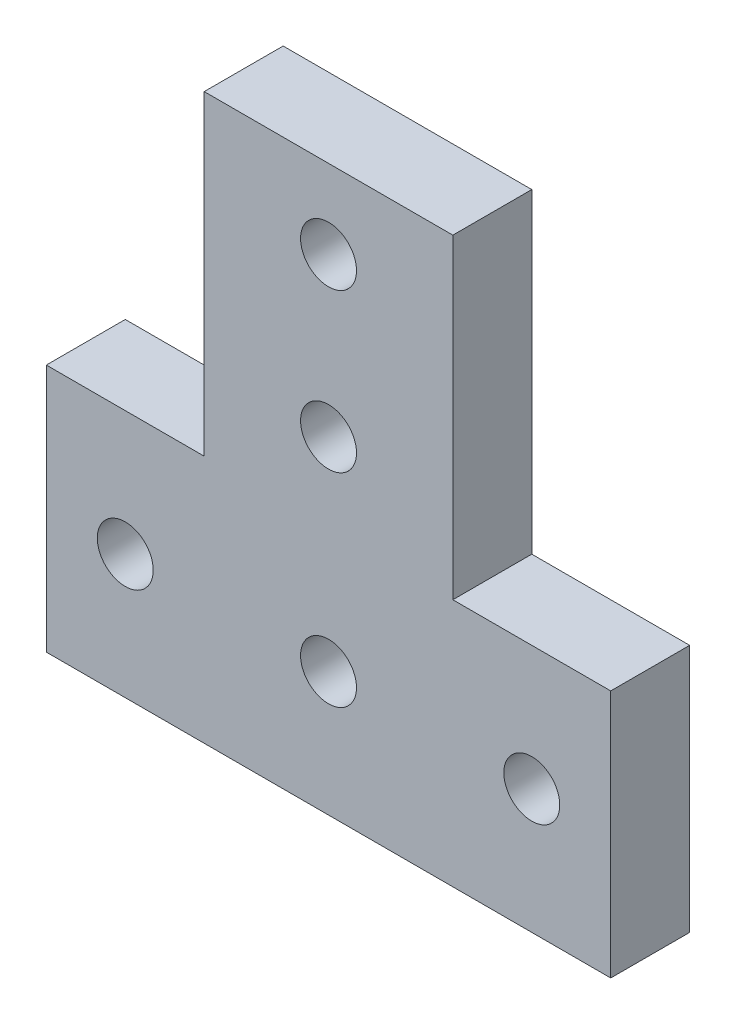
ISO-10303-21;
HEADER;
FILE_DESCRIPTION(('STEP AP214'),'2;1');
FILE_NAME('part.step','',(''),(''),'','','');
FILE_SCHEMA(('AUTOMOTIVE_DESIGN { 1 0 10303 214 1 1 1 1 }'));
ENDSEC;
DATA;
#1=APPLICATION_CONTEXT('core data for automotive mechanical design processes');
#2=APPLICATION_PROTOCOL_DEFINITION('international standard','automotive_design',2000,#1);
#3=PRODUCT_CONTEXT('',#1,'mechanical');
#4=PRODUCT('Part','Part','',(#3));
#5=PRODUCT_RELATED_PRODUCT_CATEGORY('part','',(#4));
#6=PRODUCT_DEFINITION_FORMATION('','',#4);
#7=PRODUCT_DEFINITION_CONTEXT('part definition',#1,'design');
#8=PRODUCT_DEFINITION('design','',#6,#7);
#9=PRODUCT_DEFINITION_SHAPE('','',#8);
#10=(LENGTH_UNIT() NAMED_UNIT(*) SI_UNIT(.MILLI.,.METRE.));
#11=(NAMED_UNIT(*) PLANE_ANGLE_UNIT() SI_UNIT($,.RADIAN.));
#12=(NAMED_UNIT(*) SI_UNIT($,.STERADIAN.) SOLID_ANGLE_UNIT());
#13=UNCERTAINTY_MEASURE_WITH_UNIT(LENGTH_MEASURE(1.E-05),#10,'distance_accuracy_value','');
#14=(GEOMETRIC_REPRESENTATION_CONTEXT(3) GLOBAL_UNCERTAINTY_ASSIGNED_CONTEXT((#13)) GLOBAL_UNIT_ASSIGNED_CONTEXT((#10,
#11,#12)) REPRESENTATION_CONTEXT('',''));
#15=CARTESIAN_POINT('',(0.,0.,0.));
#16=DIRECTION('',(0.,0.,1.));
#17=DIRECTION('',(1.,0.,0.));
#18=AXIS2_PLACEMENT_3D('',#15,#16,#17);
#19=CARTESIAN_POINT('',(10.,0.,6.35));
#20=DIRECTION('',(-1.,0.,0.));
#21=DIRECTION('',(0.,0.,1.));
#22=AXIS2_PLACEMENT_3D('',#19,#20,#21);
#23=PLANE('',#22);
#24=DIRECTION('',(0.,1.,0.));
#25=VECTOR('',#24,1.);
#26=CARTESIAN_POINT('',(10.,0.,0.));
#27=LINE('',#26,#25);
#28=CARTESIAN_POINT('',(10.,-12.7,0.));
#29=VERTEX_POINT('',#28);
#30=CARTESIAN_POINT('',(10.,12.7,0.));
#31=VERTEX_POINT('',#30);
#32=EDGE_CURVE('E145',#29,#31,#27,.T.);
#33=ORIENTED_EDGE('',*,*,#32,.T.);
#34=DIRECTION('',(0.,0.,-1.));
#35=VECTOR('',#34,1.);
#36=CARTESIAN_POINT('',(10.,12.7,6.35));
#37=LINE('',#36,#35);
#38=CARTESIAN_POINT('',(10.,12.7,6.35));
#39=VERTEX_POINT('',#38);
#40=EDGE_CURVE('E11',#39,#31,#37,.T.);
#41=ORIENTED_EDGE('',*,*,#40,.F.);
#42=DIRECTION('',(0.,1.,0.));
#43=VECTOR('',#42,1.);
#44=CARTESIAN_POINT('',(10.,0.,6.35));
#45=LINE('',#44,#43);
#46=CARTESIAN_POINT('',(10.,-12.7,6.35));
#47=VERTEX_POINT('',#46);
#48=EDGE_CURVE('E88',#47,#39,#45,.T.);
#49=ORIENTED_EDGE('',*,*,#48,.F.);
#50=DIRECTION('',(0.,0.,-1.));
#51=VECTOR('',#50,1.);
#52=CARTESIAN_POINT('',(10.,-12.7,6.35));
#53=LINE('',#52,#51);
#54=EDGE_CURVE('E51',#47,#29,#53,.T.);
#55=ORIENTED_EDGE('',*,*,#54,.T.);
#56=EDGE_LOOP('',(#33,#41,#49,#55));
#57=FACE_BOUND('',#56,.T.);
#58=ADVANCED_FACE('F35',(#57),#23,.F.);
#59=CARTESIAN_POINT('',(0.,12.7,6.35));
#60=DIRECTION('',(0.,1.,0.));
#61=DIRECTION('',(0.,0.,1.));
#62=AXIS2_PLACEMENT_3D('',#59,#60,#61);
#63=PLANE('',#62);
#64=DIRECTION('',(1.,0.,0.));
#65=VECTOR('',#64,1.);
#66=CARTESIAN_POINT('',(0.,12.7,0.));
#67=LINE('',#66,#65);
#68=CARTESIAN_POINT('',(-10.,12.7,0.));
#69=VERTEX_POINT('',#68);
#70=EDGE_CURVE('E147',#69,#31,#67,.T.);
#71=ORIENTED_EDGE('',*,*,#70,.F.);
#72=DIRECTION('',(0.,0.,-1.));
#73=VECTOR('',#72,1.);
#74=CARTESIAN_POINT('',(-10.,12.7,6.35));
#75=LINE('',#74,#73);
#76=CARTESIAN_POINT('',(-10.,12.7,6.35));
#77=VERTEX_POINT('',#76);
#78=EDGE_CURVE('E43',#77,#69,#75,.T.);
#79=ORIENTED_EDGE('',*,*,#78,.F.);
#80=DIRECTION('',(1.,0.,0.));
#81=VECTOR('',#80,1.);
#82=CARTESIAN_POINT('',(0.,12.7,6.35));
#83=LINE('',#82,#81);
#84=EDGE_CURVE('E211',#77,#39,#83,.T.);
#85=ORIENTED_EDGE('',*,*,#84,.T.);
#86=ORIENTED_EDGE('',*,*,#40,.T.);
#87=EDGE_LOOP('',(#71,#79,#85,#86));
#88=FACE_BOUND('',#87,.T.);
#89=ADVANCED_FACE('F195',(#88),#63,.T.);
#90=CARTESIAN_POINT('',(-10.,0.,6.35));
#91=DIRECTION('',(-1.,0.,0.));
#92=DIRECTION('',(0.,0.,1.));
#93=AXIS2_PLACEMENT_3D('',#90,#91,#92);
#94=PLANE('',#93);
#95=DIRECTION('',(0.,1.,0.));
#96=VECTOR('',#95,1.);
#97=CARTESIAN_POINT('',(-10.,0.,0.));
#98=LINE('',#97,#96);
#99=CARTESIAN_POINT('',(-10.,-12.7,0.));
#100=VERTEX_POINT('',#99);
#101=EDGE_CURVE('E150',#100,#69,#98,.T.);
#102=ORIENTED_EDGE('',*,*,#101,.F.);
#103=DIRECTION('',(0.,0.,-1.));
#104=VECTOR('',#103,1.);
#105=CARTESIAN_POINT('',(-10.,-12.7,6.35));
#106=LINE('',#105,#104);
#107=CARTESIAN_POINT('',(-10.,-12.7,6.35));
#108=VERTEX_POINT('',#107);
#109=EDGE_CURVE('E185',#108,#100,#106,.T.);
#110=ORIENTED_EDGE('',*,*,#109,.F.);
#111=DIRECTION('',(0.,1.,0.));
#112=VECTOR('',#111,1.);
#113=CARTESIAN_POINT('',(-10.,0.,6.35));
#114=LINE('',#113,#112);
#115=EDGE_CURVE('E192',#108,#77,#114,.T.);
#116=ORIENTED_EDGE('',*,*,#115,.T.);
#117=ORIENTED_EDGE('',*,*,#78,.T.);
#118=EDGE_LOOP('',(#102,#110,#116,#117));
#119=FACE_BOUND('',#118,.T.);
#120=ADVANCED_FACE('F190',(#119),#94,.T.);
#121=CARTESIAN_POINT('',(0.,-12.7,6.35));
#122=DIRECTION('',(0.,-1.,0.));
#123=DIRECTION('',(0.,0.,-1.));
#124=AXIS2_PLACEMENT_3D('',#121,#122,#123);
#125=PLANE('',#124);
#126=DIRECTION('',(-1.,0.,0.));
#127=VECTOR('',#126,1.);
#128=CARTESIAN_POINT('',(0.,-12.7,0.));
#129=LINE('',#128,#127);
#130=CARTESIAN_POINT('',(-22.7,-12.7,0.));
#131=VERTEX_POINT('',#130);
#132=EDGE_CURVE('E153',#100,#131,#129,.T.);
#133=ORIENTED_EDGE('',*,*,#132,.T.);
#134=DIRECTION('',(0.,0.,-1.));
#135=VECTOR('',#134,1.);
#136=CARTESIAN_POINT('',(-22.7,-12.7,6.35));
#137=LINE('',#136,#135);
#138=CARTESIAN_POINT('',(-22.7,-12.7,6.35));
#139=VERTEX_POINT('',#138);
#140=EDGE_CURVE('E182',#139,#131,#137,.T.);
#141=ORIENTED_EDGE('',*,*,#140,.F.);
#142=DIRECTION('',(-1.,0.,0.));
#143=VECTOR('',#142,1.);
#144=CARTESIAN_POINT('',(0.,-12.7,6.35));
#145=LINE('',#144,#143);
#146=EDGE_CURVE('E207',#108,#139,#145,.T.);
#147=ORIENTED_EDGE('',*,*,#146,.F.);
#148=ORIENTED_EDGE('',*,*,#109,.T.);
#149=EDGE_LOOP('',(#133,#141,#147,#148));
#150=FACE_BOUND('',#149,.T.);
#151=ADVANCED_FACE('F203',(#150),#125,.F.);
#152=CARTESIAN_POINT('',(-22.7,0.,6.35));
#153=DIRECTION('',(1.,0.,0.));
#154=DIRECTION('',(0.,0.,-1.));
#155=AXIS2_PLACEMENT_3D('',#152,#153,#154);
#156=PLANE('',#155);
#157=DIRECTION('',(0.,-1.,0.));
#158=VECTOR('',#157,1.);
#159=CARTESIAN_POINT('',(-22.7,0.,0.));
#160=LINE('',#159,#158);
#161=CARTESIAN_POINT('',(-22.7,-32.7,0.));
#162=VERTEX_POINT('',#161);
#163=EDGE_CURVE('E155',#131,#162,#160,.T.);
#164=ORIENTED_EDGE('',*,*,#163,.T.);
#165=DIRECTION('',(0.,0.,-1.));
#166=VECTOR('',#165,1.);
#167=CARTESIAN_POINT('',(-22.7,-32.7,6.35));
#168=LINE('',#167,#166);
#169=CARTESIAN_POINT('',(-22.7,-32.7,6.35));
#170=VERTEX_POINT('',#169);
#171=EDGE_CURVE('E114',#170,#162,#168,.T.);
#172=ORIENTED_EDGE('',*,*,#171,.F.);
#173=DIRECTION('',(0.,-1.,0.));
#174=VECTOR('',#173,1.);
#175=CARTESIAN_POINT('',(-22.7,0.,6.35));
#176=LINE('',#175,#174);
#177=EDGE_CURVE('E121',#139,#170,#176,.T.);
#178=ORIENTED_EDGE('',*,*,#177,.F.);
#179=ORIENTED_EDGE('',*,*,#140,.T.);
#180=EDGE_LOOP('',(#164,#172,#178,#179));
#181=FACE_BOUND('',#180,.T.);
#182=ADVANCED_FACE('F206',(#181),#156,.F.);
#183=CARTESIAN_POINT('',(0.,-32.7,6.35));
#184=DIRECTION('',(0.,-1.,0.));
#185=DIRECTION('',(0.,0.,-1.));
#186=AXIS2_PLACEMENT_3D('',#183,#184,#185);
#187=PLANE('',#186);
#188=DIRECTION('',(-1.,0.,0.));
#189=VECTOR('',#188,1.);
#190=CARTESIAN_POINT('',(0.,-32.7,0.));
#191=LINE('',#190,#189);
#192=CARTESIAN_POINT('',(22.7,-32.7,0.));
#193=VERTEX_POINT('',#192);
#194=EDGE_CURVE('E110',#193,#162,#191,.T.);
#195=ORIENTED_EDGE('',*,*,#194,.F.);
#196=DIRECTION('',(0.,0.,-1.));
#197=VECTOR('',#196,1.);
#198=CARTESIAN_POINT('',(22.7,-32.7,6.35));
#199=LINE('',#198,#197);
#200=CARTESIAN_POINT('',(22.7,-32.7,6.35));
#201=VERTEX_POINT('',#200);
#202=EDGE_CURVE('E105',#201,#193,#199,.T.);
#203=ORIENTED_EDGE('',*,*,#202,.F.);
#204=DIRECTION('',(-1.,0.,0.));
#205=VECTOR('',#204,1.);
#206=CARTESIAN_POINT('',(0.,-32.7,6.35));
#207=LINE('',#206,#205);
#208=EDGE_CURVE('E108',#201,#170,#207,.T.);
#209=ORIENTED_EDGE('',*,*,#208,.T.);
#210=ORIENTED_EDGE('',*,*,#171,.T.);
#211=EDGE_LOOP('',(#195,#203,#209,#210));
#212=FACE_BOUND('',#211,.T.);
#213=ADVANCED_FACE('F107',(#212),#187,.T.);
#214=CARTESIAN_POINT('',(22.7,0.,6.35));
#215=DIRECTION('',(1.,0.,0.));
#216=DIRECTION('',(0.,0.,-1.));
#217=AXIS2_PLACEMENT_3D('',#214,#215,#216);
#218=PLANE('',#217);
#219=DIRECTION('',(0.,-1.,0.));
#220=VECTOR('',#219,1.);
#221=CARTESIAN_POINT('',(22.7,0.,0.));
#222=LINE('',#221,#220);
#223=CARTESIAN_POINT('',(22.7,-12.7,0.));
#224=VERTEX_POINT('',#223);
#225=EDGE_CURVE('E159',#224,#193,#222,.T.);
#226=ORIENTED_EDGE('',*,*,#225,.F.);
#227=DIRECTION('',(0.,0.,-1.));
#228=VECTOR('',#227,1.);
#229=CARTESIAN_POINT('',(22.7,-12.7,6.35));
#230=LINE('',#229,#228);
#231=CARTESIAN_POINT('',(22.7,-12.7,6.35));
#232=VERTEX_POINT('',#231);
#233=EDGE_CURVE('E76',#232,#224,#230,.T.);
#234=ORIENTED_EDGE('',*,*,#233,.F.);
#235=DIRECTION('',(0.,-1.,0.));
#236=VECTOR('',#235,1.);
#237=CARTESIAN_POINT('',(22.7,0.,6.35));
#238=LINE('',#237,#236);
#239=EDGE_CURVE('E119',#232,#201,#238,.T.);
#240=ORIENTED_EDGE('',*,*,#239,.T.);
#241=ORIENTED_EDGE('',*,*,#202,.T.);
#242=EDGE_LOOP('',(#226,#234,#240,#241));
#243=FACE_BOUND('',#242,.T.);
#244=ADVANCED_FACE('F124',(#243),#218,.T.);
#245=CARTESIAN_POINT('',(0.,-22.7,6.35));
#246=DIRECTION('',(0.,0.,-1.));
#247=DIRECTION('',(-1.,0.,0.));
#248=AXIS2_PLACEMENT_3D('',#245,#246,#247);
#249=CYLINDRICAL_SURFACE('',#248,2.25);
#250=CARTESIAN_POINT('',(0.,-22.7,6.35));
#251=DIRECTION('',(0.,0.,1.));
#252=DIRECTION('',(1.,0.,0.));
#253=AXIS2_PLACEMENT_3D('',#250,#251,#252);
#254=CIRCLE('',#253,2.25);
#255=CARTESIAN_POINT('',(2.25,-22.7,6.35));
#256=VERTEX_POINT('',#255);
#257=EDGE_CURVE('E139',#256,#256,#254,.T.);
#258=ORIENTED_EDGE('',*,*,#257,.T.);
#259=EDGE_LOOP('',(#258));
#260=FACE_BOUND('',#259,.T.);
#261=CARTESIAN_POINT('',(0.,-22.7,0.));
#262=DIRECTION('',(0.,0.,1.));
#263=DIRECTION('',(1.,0.,0.));
#264=AXIS2_PLACEMENT_3D('',#261,#262,#263);
#265=CIRCLE('',#264,2.25);
#266=CARTESIAN_POINT('',(2.25,-22.7,0.));
#267=VERTEX_POINT('',#266);
#268=EDGE_CURVE('E173',#267,#267,#265,.T.);
#269=ORIENTED_EDGE('',*,*,#268,.F.);
#270=EDGE_LOOP('',(#269));
#271=FACE_BOUND('',#270,.T.);
#272=ADVANCED_FACE('F243',(#260,#271),#249,.F.);
#273=CARTESIAN_POINT('',(0.,-6.35,6.35));
#274=DIRECTION('',(0.,0.,-1.));
#275=DIRECTION('',(-1.,0.,0.));
#276=AXIS2_PLACEMENT_3D('',#273,#274,#275);
#277=CYLINDRICAL_SURFACE('',#276,2.25);
#278=CARTESIAN_POINT('',(0.,-6.35,6.35));
#279=DIRECTION('',(0.,0.,1.));
#280=DIRECTION('',(1.,0.,0.));
#281=AXIS2_PLACEMENT_3D('',#278,#279,#280);
#282=CIRCLE('',#281,2.25);
#283=CARTESIAN_POINT('',(2.25,-6.35,6.35));
#284=VERTEX_POINT('',#283);
#285=EDGE_CURVE('E136',#284,#284,#282,.T.);
#286=ORIENTED_EDGE('',*,*,#285,.T.);
#287=EDGE_LOOP('',(#286));
#288=FACE_BOUND('',#287,.T.);
#289=CARTESIAN_POINT('',(0.,-6.35,0.));
#290=DIRECTION('',(0.,0.,1.));
#291=DIRECTION('',(1.,0.,0.));
#292=AXIS2_PLACEMENT_3D('',#289,#290,#291);
#293=CIRCLE('',#292,2.25);
#294=CARTESIAN_POINT('',(2.25,-6.35,0.));
#295=VERTEX_POINT('',#294);
#296=EDGE_CURVE('E170',#295,#295,#293,.T.);
#297=ORIENTED_EDGE('',*,*,#296,.F.);
#298=EDGE_LOOP('',(#297));
#299=FACE_BOUND('',#298,.T.);
#300=ADVANCED_FACE('F247',(#288,#299),#277,.F.);
#301=CARTESIAN_POINT('',(16.35,-22.7,6.35));
#302=DIRECTION('',(0.,0.,-1.));
#303=DIRECTION('',(-1.,0.,0.));
#304=AXIS2_PLACEMENT_3D('',#301,#302,#303);
#305=CYLINDRICAL_SURFACE('',#304,2.25);
#306=CARTESIAN_POINT('',(16.35,-22.7,6.35));
#307=DIRECTION('',(0.,0.,1.));
#308=DIRECTION('',(1.,0.,0.));
#309=AXIS2_PLACEMENT_3D('',#306,#307,#308);
#310=CIRCLE('',#309,2.25);
#311=CARTESIAN_POINT('',(18.6,-22.7,6.35));
#312=VERTEX_POINT('',#311);
#313=EDGE_CURVE('E133',#312,#312,#310,.T.);
#314=ORIENTED_EDGE('',*,*,#313,.T.);
#315=EDGE_LOOP('',(#314));
#316=FACE_BOUND('',#315,.T.);
#317=CARTESIAN_POINT('',(16.35,-22.7,0.));
#318=DIRECTION('',(0.,0.,1.));
#319=DIRECTION('',(1.,0.,0.));
#320=AXIS2_PLACEMENT_3D('',#317,#318,#319);
#321=CIRCLE('',#320,2.25);
#322=CARTESIAN_POINT('',(18.6,-22.7,0.));
#323=VERTEX_POINT('',#322);
#324=EDGE_CURVE('E167',#323,#323,#321,.T.);
#325=ORIENTED_EDGE('',*,*,#324,.F.);
#326=EDGE_LOOP('',(#325));
#327=FACE_BOUND('',#326,.T.);
#328=ADVANCED_FACE('F224',(#316,#327),#305,.F.);
#329=CARTESIAN_POINT('',(0.,6.35,6.35));
#330=DIRECTION('',(0.,0.,-1.));
#331=DIRECTION('',(-1.,0.,0.));
#332=AXIS2_PLACEMENT_3D('',#329,#330,#331);
#333=CYLINDRICAL_SURFACE('',#332,2.25);
#334=CARTESIAN_POINT('',(0.,6.35,6.35));
#335=DIRECTION('',(0.,0.,1.));
#336=DIRECTION('',(1.,0.,0.));
#337=AXIS2_PLACEMENT_3D('',#334,#335,#336);
#338=CIRCLE('',#337,2.25);
#339=CARTESIAN_POINT('',(2.25,6.35,6.35));
#340=VERTEX_POINT('',#339);
#341=EDGE_CURVE('E127',#340,#340,#338,.T.);
#342=ORIENTED_EDGE('',*,*,#341,.T.);
#343=EDGE_LOOP('',(#342));
#344=FACE_BOUND('',#343,.T.);
#345=CARTESIAN_POINT('',(0.,6.35,0.));
#346=DIRECTION('',(0.,0.,1.));
#347=DIRECTION('',(1.,0.,0.));
#348=AXIS2_PLACEMENT_3D('',#345,#346,#347);
#349=CIRCLE('',#348,2.25);
#350=CARTESIAN_POINT('',(2.25,6.35,0.));
#351=VERTEX_POINT('',#350);
#352=EDGE_CURVE('E164',#351,#351,#349,.T.);
#353=ORIENTED_EDGE('',*,*,#352,.F.);
#354=EDGE_LOOP('',(#353));
#355=FACE_BOUND('',#354,.T.);
#356=ADVANCED_FACE('F216',(#344,#355),#333,.F.);
#357=CARTESIAN_POINT('',(0.,-12.7,6.35));
#358=DIRECTION('',(0.,1.,0.));
#359=DIRECTION('',(0.,0.,1.));
#360=AXIS2_PLACEMENT_3D('',#357,#358,#359);
#361=PLANE('',#360);
#362=DIRECTION('',(1.,0.,0.));
#363=VECTOR('',#362,1.);
#364=CARTESIAN_POINT('',(0.,-12.7,0.));
#365=LINE('',#364,#363);
#366=EDGE_CURVE('E161',#29,#224,#365,.T.);
#367=ORIENTED_EDGE('',*,*,#366,.F.);
#368=ORIENTED_EDGE('',*,*,#54,.F.);
#369=DIRECTION('',(1.,0.,0.));
#370=VECTOR('',#369,1.);
#371=CARTESIAN_POINT('',(0.,-12.7,6.35));
#372=LINE('',#371,#370);
#373=EDGE_CURVE('E125',#47,#232,#372,.T.);
#374=ORIENTED_EDGE('',*,*,#373,.T.);
#375=ORIENTED_EDGE('',*,*,#233,.T.);
#376=EDGE_LOOP('',(#367,#368,#374,#375));
#377=FACE_BOUND('',#376,.T.);
#378=ADVANCED_FACE('F213',(#377),#361,.T.);
#379=CARTESIAN_POINT('',(-16.35,-22.7,6.35));
#380=DIRECTION('',(0.,0.,-1.));
#381=DIRECTION('',(-1.,0.,0.));
#382=AXIS2_PLACEMENT_3D('',#379,#380,#381);
#383=CYLINDRICAL_SURFACE('',#382,2.25);
#384=CARTESIAN_POINT('',(-16.35,-22.7,6.35));
#385=DIRECTION('',(0.,0.,1.));
#386=DIRECTION('',(1.,0.,0.));
#387=AXIS2_PLACEMENT_3D('',#384,#385,#386);
#388=CIRCLE('',#387,2.25);
#389=CARTESIAN_POINT('',(-14.1,-22.7,6.35));
#390=VERTEX_POINT('',#389);
#391=EDGE_CURVE('E142',#390,#390,#388,.T.);
#392=ORIENTED_EDGE('',*,*,#391,.T.);
#393=EDGE_LOOP('',(#392));
#394=FACE_BOUND('',#393,.T.);
#395=CARTESIAN_POINT('',(-16.35,-22.7,0.));
#396=DIRECTION('',(0.,0.,1.));
#397=DIRECTION('',(1.,0.,0.));
#398=AXIS2_PLACEMENT_3D('',#395,#396,#397);
#399=CIRCLE('',#398,2.25);
#400=CARTESIAN_POINT('',(-14.1,-22.7,0.));
#401=VERTEX_POINT('',#400);
#402=EDGE_CURVE('E176',#401,#401,#399,.T.);
#403=ORIENTED_EDGE('',*,*,#402,.F.);
#404=EDGE_LOOP('',(#403));
#405=FACE_BOUND('',#404,.T.);
#406=ADVANCED_FACE('F215',(#394,#405),#383,.F.);
#407=CARTESIAN_POINT('',(0.,0.,6.35));
#408=DIRECTION('',(0.,0.,1.));
#409=DIRECTION('',(1.,0.,0.));
#410=AXIS2_PLACEMENT_3D('',#407,#408,#409);
#411=PLANE('',#410);
#412=ORIENTED_EDGE('',*,*,#48,.T.);
#413=ORIENTED_EDGE('',*,*,#84,.F.);
#414=ORIENTED_EDGE('',*,*,#115,.F.);
#415=ORIENTED_EDGE('',*,*,#146,.T.);
#416=ORIENTED_EDGE('',*,*,#177,.T.);
#417=ORIENTED_EDGE('',*,*,#208,.F.);
#418=ORIENTED_EDGE('',*,*,#239,.F.);
#419=ORIENTED_EDGE('',*,*,#373,.F.);
#420=EDGE_LOOP('',(#412,#413,#414,#415,#416,#417,#418,#419));
#421=FACE_BOUND('',#420,.T.);
#422=ORIENTED_EDGE('',*,*,#341,.F.);
#423=EDGE_LOOP('',(#422));
#424=FACE_BOUND('',#423,.T.);
#425=ORIENTED_EDGE('',*,*,#313,.F.);
#426=EDGE_LOOP('',(#425));
#427=FACE_BOUND('',#426,.T.);
#428=ORIENTED_EDGE('',*,*,#285,.F.);
#429=EDGE_LOOP('',(#428));
#430=FACE_BOUND('',#429,.T.);
#431=ORIENTED_EDGE('',*,*,#257,.F.);
#432=EDGE_LOOP('',(#431));
#433=FACE_BOUND('',#432,.T.);
#434=ORIENTED_EDGE('',*,*,#391,.F.);
#435=EDGE_LOOP('',(#434));
#436=FACE_BOUND('',#435,.T.);
#437=ADVANCED_FACE('F117',(#421,#424,#427,#430,#433,#436),#411,.T.);
#438=CARTESIAN_POINT('',(0.,0.,0.));
#439=DIRECTION('',(0.,0.,1.));
#440=DIRECTION('',(1.,0.,0.));
#441=AXIS2_PLACEMENT_3D('',#438,#439,#440);
#442=PLANE('',#441);
#443=ORIENTED_EDGE('',*,*,#32,.F.);
#444=ORIENTED_EDGE('',*,*,#366,.T.);
#445=ORIENTED_EDGE('',*,*,#225,.T.);
#446=ORIENTED_EDGE('',*,*,#194,.T.);
#447=ORIENTED_EDGE('',*,*,#163,.F.);
#448=ORIENTED_EDGE('',*,*,#132,.F.);
#449=ORIENTED_EDGE('',*,*,#101,.T.);
#450=ORIENTED_EDGE('',*,*,#70,.T.);
#451=EDGE_LOOP('',(#443,#444,#445,#446,#447,#448,#449,#450));
#452=FACE_BOUND('',#451,.T.);
#453=ORIENTED_EDGE('',*,*,#352,.T.);
#454=EDGE_LOOP('',(#453));
#455=FACE_BOUND('',#454,.T.);
#456=ORIENTED_EDGE('',*,*,#324,.T.);
#457=EDGE_LOOP('',(#456));
#458=FACE_BOUND('',#457,.T.);
#459=ORIENTED_EDGE('',*,*,#296,.T.);
#460=EDGE_LOOP('',(#459));
#461=FACE_BOUND('',#460,.T.);
#462=ORIENTED_EDGE('',*,*,#268,.T.);
#463=EDGE_LOOP('',(#462));
#464=FACE_BOUND('',#463,.T.);
#465=ORIENTED_EDGE('',*,*,#402,.T.);
#466=EDGE_LOOP('',(#465));
#467=FACE_BOUND('',#466,.T.);
#468=ADVANCED_FACE('F198',(#452,#455,#458,#461,#464,#467),#442,.F.);
#469=CLOSED_SHELL('',(#58,#89,#120,#151,#182,#213,#244,#272,#300,#328,#356,#378,#406,#437,#468));
#470=MANIFOLD_SOLID_BREP('B2',#469);
#471=ADVANCED_BREP_SHAPE_REPRESENTATION('',(#18,#470),#14);
#472=SHAPE_DEFINITION_REPRESENTATION(#9,#471);
ENDSEC;
END-ISO-10303-21;
